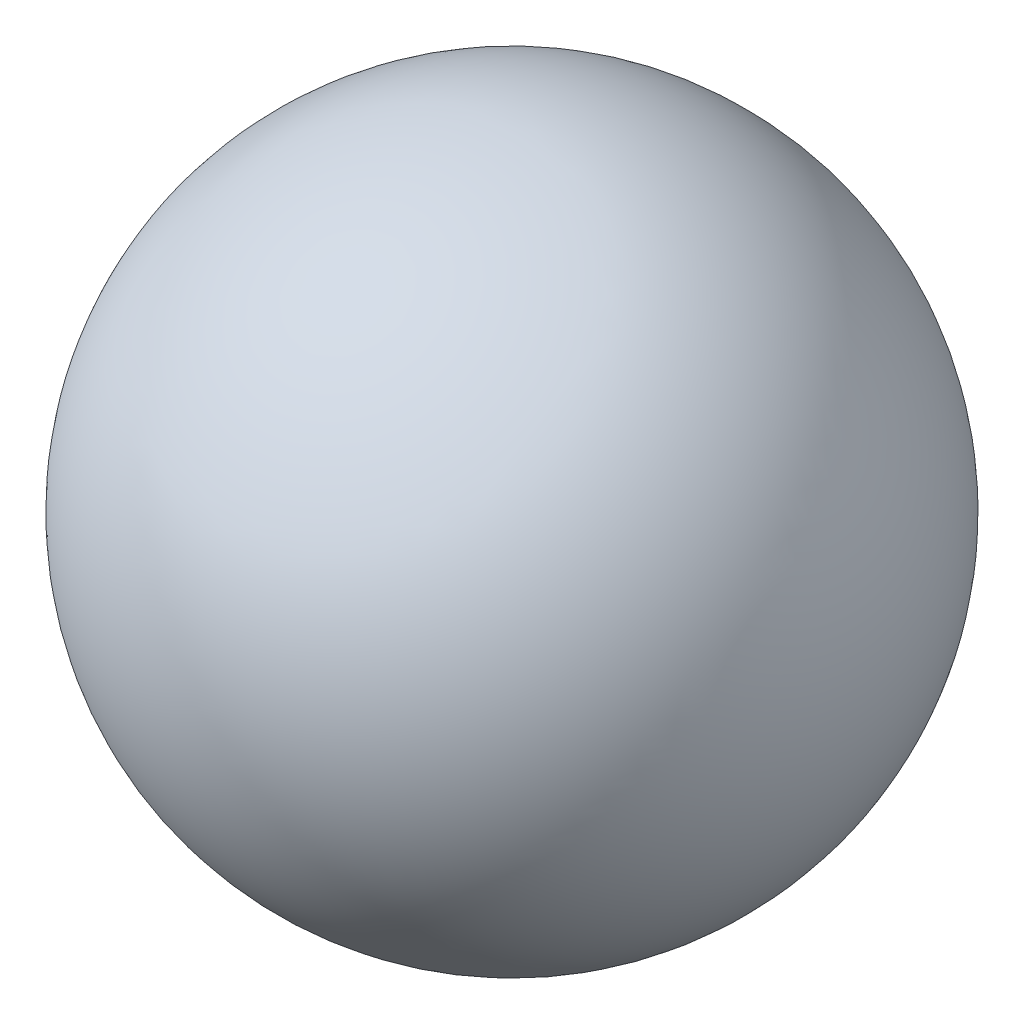
ISO-10303-21;
HEADER;
FILE_DESCRIPTION(('STEP AP214'),'2;1');
FILE_NAME('part.step','',(''),(''),'','','');
FILE_SCHEMA(('AUTOMOTIVE_DESIGN { 1 0 10303 214 1 1 1 1 }'));
ENDSEC;
DATA;
#1=APPLICATION_CONTEXT('core data for automotive mechanical design processes');
#2=APPLICATION_PROTOCOL_DEFINITION('international standard','automotive_design',2000,#1);
#3=PRODUCT_CONTEXT('',#1,'mechanical');
#4=PRODUCT('Part','Part','',(#3));
#5=PRODUCT_RELATED_PRODUCT_CATEGORY('part','',(#4));
#6=PRODUCT_DEFINITION_FORMATION('','',#4);
#7=PRODUCT_DEFINITION_CONTEXT('part definition',#1,'design');
#8=PRODUCT_DEFINITION('design','',#6,#7);
#9=PRODUCT_DEFINITION_SHAPE('','',#8);
#10=(LENGTH_UNIT() NAMED_UNIT(*) SI_UNIT(.MILLI.,.METRE.));
#11=(NAMED_UNIT(*) PLANE_ANGLE_UNIT() SI_UNIT($,.RADIAN.));
#12=(NAMED_UNIT(*) SI_UNIT($,.STERADIAN.) SOLID_ANGLE_UNIT());
#13=UNCERTAINTY_MEASURE_WITH_UNIT(LENGTH_MEASURE(1.E-05),#10,'distance_accuracy_value','');
#14=(GEOMETRIC_REPRESENTATION_CONTEXT(3) GLOBAL_UNCERTAINTY_ASSIGNED_CONTEXT((#13)) GLOBAL_UNIT_ASSIGNED_CONTEXT((#10,
#11,#12)) REPRESENTATION_CONTEXT('',''));
#15=CARTESIAN_POINT('',(0.,0.,0.));
#16=DIRECTION('',(0.,0.,1.));
#17=DIRECTION('',(1.,0.,0.));
#18=AXIS2_PLACEMENT_3D('',#15,#16,#17);
#19=CARTESIAN_POINT('',(9.,51.25,0.));
#20=DIRECTION('',(-1.,0.,0.));
#21=DIRECTION('',(0.,1.,0.));
#22=AXIS2_PLACEMENT_3D('',#19,#20,#21);
#23=SPHERICAL_SURFACE('',#22,5.1595);
#24=CARTESIAN_POINT('',(3.8405,51.25,0.));
#25=VERTEX_POINT('',#24);
#26=VERTEX_LOOP('',#25);
#27=FACE_BOUND('',#26,.T.);
#28=ADVANCED_FACE('F29',(#27),#23,.T.);
#29=CLOSED_SHELL('',(#28));
#30=MANIFOLD_SOLID_BREP('B2',#29);
#31=ADVANCED_BREP_SHAPE_REPRESENTATION('',(#18,#30),#14);
#32=SHAPE_DEFINITION_REPRESENTATION(#9,#31);
ENDSEC;
END-ISO-10303-21;
